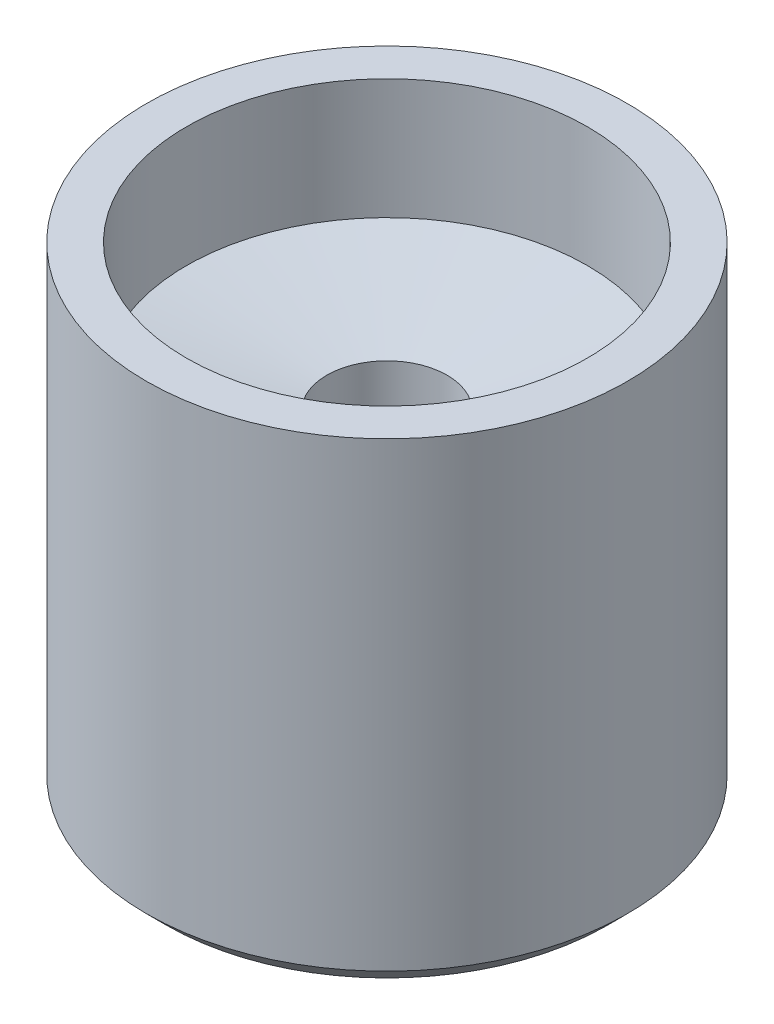
ISO-10303-21;
HEADER;
FILE_DESCRIPTION(('STEP AP214'),'2;1');
FILE_NAME('part.step','',(''),(''),'','','');
FILE_SCHEMA(('AUTOMOTIVE_DESIGN { 1 0 10303 214 1 1 1 1 }'));
ENDSEC;
DATA;
#1=APPLICATION_CONTEXT('core data for automotive mechanical design processes');
#2=APPLICATION_PROTOCOL_DEFINITION('international standard','automotive_design',2000,#1);
#3=PRODUCT_CONTEXT('',#1,'mechanical');
#4=PRODUCT('Part','Part','',(#3));
#5=PRODUCT_RELATED_PRODUCT_CATEGORY('part','',(#4));
#6=PRODUCT_DEFINITION_FORMATION('','',#4);
#7=PRODUCT_DEFINITION_CONTEXT('part definition',#1,'design');
#8=PRODUCT_DEFINITION('design','',#6,#7);
#9=PRODUCT_DEFINITION_SHAPE('','',#8);
#10=(LENGTH_UNIT() NAMED_UNIT(*) SI_UNIT(.MILLI.,.METRE.));
#11=(NAMED_UNIT(*) PLANE_ANGLE_UNIT() SI_UNIT($,.RADIAN.));
#12=(NAMED_UNIT(*) SI_UNIT($,.STERADIAN.) SOLID_ANGLE_UNIT());
#13=UNCERTAINTY_MEASURE_WITH_UNIT(LENGTH_MEASURE(1.E-05),#10,'distance_accuracy_value','');
#14=(GEOMETRIC_REPRESENTATION_CONTEXT(3) GLOBAL_UNCERTAINTY_ASSIGNED_CONTEXT((#13)) GLOBAL_UNIT_ASSIGNED_CONTEXT((#10,
#11,#12)) REPRESENTATION_CONTEXT('',''));
#15=CARTESIAN_POINT('',(0.,0.,0.));
#16=DIRECTION('',(0.,0.,1.));
#17=DIRECTION('',(1.,0.,0.));
#18=AXIS2_PLACEMENT_3D('',#15,#16,#17);
#19=CARTESIAN_POINT('',(0.,12.,0.));
#20=DIRECTION('',(0.,-1.,0.));
#21=DIRECTION('',(0.,0.,-1.));
#22=AXIS2_PLACEMENT_3D('',#19,#20,#21);
#23=CYLINDRICAL_SURFACE('',#22,6.);
#24=CARTESIAN_POINT('',(0.,0.5,0.));
#25=DIRECTION('',(0.,1.,0.));
#26=DIRECTION('',(0.,0.,1.));
#27=AXIS2_PLACEMENT_3D('',#24,#25,#26);
#28=CIRCLE('',#27,6.);
#29=CARTESIAN_POINT('',(0.,0.5,6.));
#30=VERTEX_POINT('',#29);
#31=EDGE_CURVE('E41',#30,#30,#28,.T.);
#32=ORIENTED_EDGE('',*,*,#31,.T.);
#33=EDGE_LOOP('',(#32));
#34=FACE_BOUND('',#33,.T.);
#35=CARTESIAN_POINT('',(0.,12.,0.));
#36=DIRECTION('',(0.,1.,0.));
#37=DIRECTION('',(0.,0.,1.));
#38=AXIS2_PLACEMENT_3D('',#35,#36,#37);
#39=CIRCLE('',#38,6.);
#40=CARTESIAN_POINT('',(0.,12.,6.));
#41=VERTEX_POINT('',#40);
#42=EDGE_CURVE('E45',#41,#41,#39,.T.);
#43=ORIENTED_EDGE('',*,*,#42,.F.);
#44=EDGE_LOOP('',(#43));
#45=FACE_BOUND('',#44,.T.);
#46=ADVANCED_FACE('F33',(#34,#45),#23,.T.);
#47=CARTESIAN_POINT('',(0.,12.,0.));
#48=DIRECTION('',(0.,1.,0.));
#49=DIRECTION('',(0.,0.,1.));
#50=AXIS2_PLACEMENT_3D('',#47,#48,#49);
#51=PLANE('',#50);
#52=CARTESIAN_POINT('',(0.,12.,0.));
#53=DIRECTION('',(0.,1.,0.));
#54=DIRECTION('',(0.,0.,1.));
#55=AXIS2_PLACEMENT_3D('',#52,#53,#54);
#56=CIRCLE('',#55,5.);
#57=CARTESIAN_POINT('',(0.,12.,5.));
#58=VERTEX_POINT('',#57);
#59=EDGE_CURVE('E49',#58,#58,#56,.T.);
#60=ORIENTED_EDGE('',*,*,#59,.F.);
#61=EDGE_LOOP('',(#60));
#62=FACE_BOUND('',#61,.T.);
#63=ORIENTED_EDGE('',*,*,#42,.T.);
#64=EDGE_LOOP('',(#63));
#65=FACE_BOUND('',#64,.T.);
#66=ADVANCED_FACE('F78',(#62,#65),#51,.T.);
#67=CARTESIAN_POINT('',(0.,0.,0.));
#68=DIRECTION('',(0.,1.,0.));
#69=DIRECTION('',(0.,0.,1.));
#70=AXIS2_PLACEMENT_3D('',#67,#68,#69);
#71=PLANE('',#70);
#72=CARTESIAN_POINT('',(0.,0.,0.));
#73=DIRECTION('',(0.,1.,0.));
#74=DIRECTION('',(0.,0.,1.));
#75=AXIS2_PLACEMENT_3D('',#72,#73,#74);
#76=CIRCLE('',#75,5.5);
#77=CARTESIAN_POINT('',(0.,0.,5.5));
#78=VERTEX_POINT('',#77);
#79=EDGE_CURVE('E10',#78,#78,#76,.F.);
#80=ORIENTED_EDGE('',*,*,#79,.T.);
#81=EDGE_LOOP('',(#80));
#82=FACE_BOUND('',#81,.T.);
#83=ADVANCED_FACE('F82',(#82),#71,.F.);
#84=CARTESIAN_POINT('',(0.,9.,0.));
#85=DIRECTION('',(0.,1.,0.));
#86=DIRECTION('',(0.,0.,1.));
#87=AXIS2_PLACEMENT_3D('',#84,#85,#86);
#88=CYLINDRICAL_SURFACE('',#87,5.);
#89=CARTESIAN_POINT('',(0.,9.,0.));
#90=DIRECTION('',(0.,-1.,0.));
#91=DIRECTION('',(0.,0.,-1.));
#92=AXIS2_PLACEMENT_3D('',#89,#90,#91);
#93=CIRCLE('',#92,5.);
#94=CARTESIAN_POINT('',(0.,9.,5.00000000000001));
#95=VERTEX_POINT('',#94);
#96=EDGE_CURVE('E54',#95,#95,#93,.T.);
#97=ORIENTED_EDGE('',*,*,#96,.T.);
#98=EDGE_LOOP('',(#97));
#99=FACE_BOUND('',#98,.T.);
#100=ORIENTED_EDGE('',*,*,#59,.T.);
#101=EDGE_LOOP('',(#100));
#102=FACE_BOUND('',#101,.T.);
#103=ADVANCED_FACE('F88',(#99,#102),#88,.F.);
#104=CARTESIAN_POINT('',(0.,9.,0.));
#105=DIRECTION('',(0.,1.,0.));
#106=DIRECTION('',(0.,0.,1.));
#107=AXIS2_PLACEMENT_3D('',#104,#105,#106);
#108=CONICAL_SURFACE('',#107,5.,1.39626340159546);
#109=CARTESIAN_POINT('',(0.,8.38285556752036,0.));
#110=DIRECTION('',(0.,-1.,0.));
#111=DIRECTION('',(0.,0.,-1.));
#112=AXIS2_PLACEMENT_3D('',#109,#110,#111);
#113=CIRCLE('',#112,1.5);
#114=CARTESIAN_POINT('',(0.,8.38285556752036,1.5));
#115=VERTEX_POINT('',#114);
#116=EDGE_CURVE('E57',#115,#115,#113,.T.);
#117=CARTESIAN_POINT('',(0.,8.38285556752036,1.5));
#118=CARTESIAN_POINT('',(0.,8.38928415535869,1.53645833333334));
#119=CARTESIAN_POINT('',(0.,8.39571274319702,1.57291666666667));
#120=CARTESIAN_POINT('',(0.,8.40856991887368,1.64583333333334));
#121=CARTESIAN_POINT('',(0.,8.41499850671201,1.68229166666667));
#122=CARTESIAN_POINT('',(0.,8.42785568238867,1.75520833333334));
#123=CARTESIAN_POINT('',(0.,8.434284270227,1.79166666666667));
#124=CARTESIAN_POINT('',(0.,8.44714144590366,1.86458333333334));
#125=CARTESIAN_POINT('',(0.,8.45357003374199,1.90104166666667));
#126=CARTESIAN_POINT('',(0.,8.46642720941865,1.97395833333334));
#127=CARTESIAN_POINT('',(0.,8.47285579725698,2.01041666666667));
#128=CARTESIAN_POINT('',(0.,8.48571297293363,2.08333333333334));
#129=CARTESIAN_POINT('',(0.,8.49214156077197,2.11979166666667));
#130=CARTESIAN_POINT('',(0.,8.50499873644862,2.19270833333334));
#131=CARTESIAN_POINT('',(0.,8.51142732428695,2.22916666666667));
#132=CARTESIAN_POINT('',(0.,8.52428449996361,2.30208333333334));
#133=CARTESIAN_POINT('',(0.,8.53071308780194,2.33854166666667));
#134=CARTESIAN_POINT('',(0.,8.5435702634786,2.41145833333334));
#135=CARTESIAN_POINT('',(0.,8.54999885131693,2.44791666666667));
#136=CARTESIAN_POINT('',(0.,8.56285602699359,2.52083333333334));
#137=CARTESIAN_POINT('',(0.,8.56928461483192,2.55729166666667));
#138=CARTESIAN_POINT('',(0.,8.58214179050858,2.63020833333334));
#139=CARTESIAN_POINT('',(0.,8.58857037834691,2.66666666666667));
#140=CARTESIAN_POINT('',(0.,8.60142755402357,2.73958333333334));
#141=CARTESIAN_POINT('',(0.,8.6078561418619,2.77604166666667));
#142=CARTESIAN_POINT('',(0.,8.62071331753856,2.84895833333334));
#143=CARTESIAN_POINT('',(0.,8.62714190537689,2.88541666666667));
#144=CARTESIAN_POINT('',(0.,8.63999908105354,2.95833333333334));
#145=CARTESIAN_POINT('',(0.,8.64642766889187,2.99479166666667));
#146=CARTESIAN_POINT('',(0.,8.65928484456853,3.06770833333334));
#147=CARTESIAN_POINT('',(0.,8.66571343240686,3.10416666666667));
#148=CARTESIAN_POINT('',(0.,8.67857060808352,3.17708333333334));
#149=CARTESIAN_POINT('',(0.,8.68499919592185,3.21354166666667));
#150=CARTESIAN_POINT('',(0.,8.69785637159851,3.28645833333334));
#151=CARTESIAN_POINT('',(0.,8.70428495943684,3.32291666666667));
#152=CARTESIAN_POINT('',(0.,8.7171421351135,3.39583333333334));
#153=CARTESIAN_POINT('',(0.,8.72357072295183,3.43229166666667));
#154=CARTESIAN_POINT('',(0.,8.73642789862849,3.50520833333334));
#155=CARTESIAN_POINT('',(0.,8.74285648646682,3.54166666666667));
#156=CARTESIAN_POINT('',(0.,8.75571366214348,3.61458333333334));
#157=CARTESIAN_POINT('',(0.,8.76214224998181,3.65104166666667));
#158=CARTESIAN_POINT('',(0.,8.77499942565847,3.72395833333334));
#159=CARTESIAN_POINT('',(0.,8.7814280134968,3.76041666666667));
#160=CARTESIAN_POINT('',(0.,8.79428518917346,3.83333333333334));
#161=CARTESIAN_POINT('',(0.,8.80071377701178,3.86979166666667));
#162=CARTESIAN_POINT('',(0.,8.81357095268844,3.94270833333334));
#163=CARTESIAN_POINT('',(0.,8.81999954052677,3.97916666666667));
#164=CARTESIAN_POINT('',(0.,8.83285671620343,4.05208333333334));
#165=CARTESIAN_POINT('',(0.,8.83928530404176,4.08854166666667));
#166=CARTESIAN_POINT('',(0.,8.85214247971842,4.16145833333334));
#167=CARTESIAN_POINT('',(0.,8.85857106755675,4.19791666666667));
#168=CARTESIAN_POINT('',(0.,8.87142824323341,4.27083333333334));
#169=CARTESIAN_POINT('',(0.,8.87785683107174,4.30729166666667));
#170=CARTESIAN_POINT('',(0.,8.8907140067484,4.38020833333334));
#171=CARTESIAN_POINT('',(0.,8.89714259458673,4.41666666666667));
#172=CARTESIAN_POINT('',(0.,8.90999977026339,4.48958333333334));
#173=CARTESIAN_POINT('',(0.,8.91642835810172,4.52604166666667));
#174=CARTESIAN_POINT('',(0.,8.92928553377838,4.59895833333334));
#175=CARTESIAN_POINT('',(0.,8.93571412161671,4.63541666666667));
#176=CARTESIAN_POINT('',(0.,8.94857129729337,4.70833333333334));
#177=CARTESIAN_POINT('',(0.,8.95499988513169,4.74479166666667));
#178=CARTESIAN_POINT('',(0.,8.96785706080835,4.81770833333334));
#179=CARTESIAN_POINT('',(0.,8.97428564864668,4.85416666666667));
#180=CARTESIAN_POINT('',(0.,8.98714282432334,4.92708333333334));
#181=CARTESIAN_POINT('',(0.,8.99357141216167,4.96354166666667));
#182=CARTESIAN_POINT('',(0.,9.,5.00000000000001));
#183=B_SPLINE_CURVE_WITH_KNOTS('',3,(#117,#118,#119,#120,#121,#122,#123,#124,#125,#126,#127,
#128,#129,#130,#131,#132,#133,#134,#135,#136,#137,#138,#139,#140,#141,#142,#143,#144,#145,#146,
#147,#148,#149,#150,#151,#152,#153,#154,#155,#156,#157,#158,#159,#160,#161,#162,#163,#164,#165,
#166,#167,#168,#169,#170,#171,#172,#173,#174,#175,#176,#177,#178,#179,#180,#181,#182),
.UNSPECIFIED.,.F.,.F.,(4,2,2,2,2,2,2,2,2,2,2,2,2,2,2,2,2,2,2,2,2,2,2,2,2,2,2,2,2,2,2,2,4),(0.,
0.111062285675004,0.222124571350007,0.33318685702501,0.444249142700014,0.555311428375017,
0.666373714050021,0.777435999725024,0.888498285400027,0.999560571075031,1.11062285675003,
1.22168514242504,1.33274742810004,1.44380971377504,1.55487199945005,1.66593428512505,
1.77699657080006,1.88805885647506,1.99912114215006,2.11018342782507,2.22124571350007,
2.33230799917507,2.44337028485008,2.55443257052508,2.66549485620008,2.77655714187509,
2.88761942755009,2.99868171322509,3.1097439989001,3.2208062845751,3.33186857025011,
3.44293085592511,3.55399314160011),.UNSPECIFIED.);
#184=EDGE_CURVE('BSEAM75',#115,#95,#183,.T.);
#185=ORIENTED_EDGE('',*,*,#116,.T.);
#186=ORIENTED_EDGE('',*,*,#96,.F.);
#187=ORIENTED_EDGE('',*,*,#184,.T.);
#188=ORIENTED_EDGE('',*,*,#184,.F.);
#189=EDGE_LOOP('',(#185,#187,#186,#188));
#190=FACE_BOUND('',#189,.T.);
#191=ADVANCED_FACE('F75',(#190),#108,.F.);
#192=CARTESIAN_POINT('',(0.,3.5,0.));
#193=DIRECTION('',(0.,-1.,0.));
#194=DIRECTION('',(0.,0.,-1.));
#195=AXIS2_PLACEMENT_3D('',#192,#193,#194);
#196=CYLINDRICAL_SURFACE('',#195,1.5);
#197=CARTESIAN_POINT('',(0.,3.5,0.));
#198=DIRECTION('',(0.,-1.,0.));
#199=DIRECTION('',(0.,0.,-1.));
#200=AXIS2_PLACEMENT_3D('',#197,#198,#199);
#201=CIRCLE('',#200,1.5);
#202=CARTESIAN_POINT('',(0.,3.5,-1.5));
#203=VERTEX_POINT('',#202);
#204=EDGE_CURVE('E60',#203,#203,#201,.T.);
#205=ORIENTED_EDGE('',*,*,#204,.T.);
#206=EDGE_LOOP('',(#205));
#207=FACE_BOUND('',#206,.T.);
#208=ORIENTED_EDGE('',*,*,#116,.F.);
#209=EDGE_LOOP('',(#208));
#210=FACE_BOUND('',#209,.T.);
#211=ADVANCED_FACE('F64',(#207,#210),#196,.F.);
#212=CARTESIAN_POINT('',(-1.5,3.5,0.));
#213=DIRECTION('',(0.,1.,0.));
#214=DIRECTION('',(0.,0.,1.));
#215=AXIS2_PLACEMENT_3D('',#212,#213,#214);
#216=PLANE('',#215);
#217=ORIENTED_EDGE('',*,*,#204,.F.);
#218=EDGE_LOOP('',(#217));
#219=FACE_BOUND('',#218,.T.);
#220=ADVANCED_FACE('F67',(#219),#216,.T.);
#221=CARTESIAN_POINT('',(0.,0.5,0.));
#222=DIRECTION('',(0.,1.,0.));
#223=DIRECTION('',(0.,0.,1.));
#224=AXIS2_PLACEMENT_3D('',#221,#222,#223);
#225=CONICAL_SURFACE('',#224,6.,0.78539816339745);
#226=ORIENTED_EDGE('',*,*,#79,.F.);
#227=EDGE_LOOP('',(#226));
#228=FACE_BOUND('',#227,.T.);
#229=ORIENTED_EDGE('',*,*,#31,.F.);
#230=EDGE_LOOP('',(#229));
#231=FACE_BOUND('',#230,.T.);
#232=ADVANCED_FACE('F36',(#228,#231),#225,.T.);
#233=CLOSED_SHELL('',(#46,#66,#83,#103,#191,#211,#220,#232));
#234=MANIFOLD_SOLID_BREP('B2',#233);
#235=ADVANCED_BREP_SHAPE_REPRESENTATION('',(#18,#234),#14);
#236=SHAPE_DEFINITION_REPRESENTATION(#9,#235);
ENDSEC;
END-ISO-10303-21;
